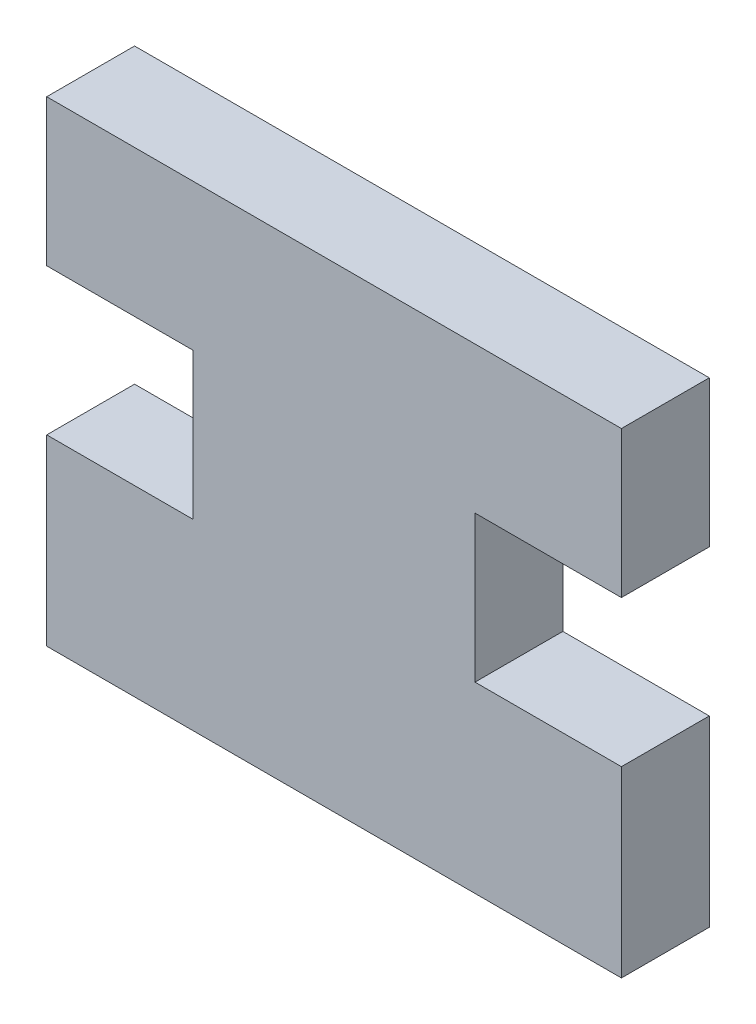
ISO-10303-21;
HEADER;
FILE_DESCRIPTION(('STEP AP214'),'2;1');
FILE_NAME('part.step','',(''),(''),'','','');
FILE_SCHEMA(('AUTOMOTIVE_DESIGN { 1 0 10303 214 1 1 1 1 }'));
ENDSEC;
DATA;
#1=APPLICATION_CONTEXT('core data for automotive mechanical design processes');
#2=APPLICATION_PROTOCOL_DEFINITION('international standard','automotive_design',2000,#1);
#3=PRODUCT_CONTEXT('',#1,'mechanical');
#4=PRODUCT('Part','Part','',(#3));
#5=PRODUCT_RELATED_PRODUCT_CATEGORY('part','',(#4));
#6=PRODUCT_DEFINITION_FORMATION('','',#4);
#7=PRODUCT_DEFINITION_CONTEXT('part definition',#1,'design');
#8=PRODUCT_DEFINITION('design','',#6,#7);
#9=PRODUCT_DEFINITION_SHAPE('','',#8);
#10=(LENGTH_UNIT() NAMED_UNIT(*) SI_UNIT(.MILLI.,.METRE.));
#11=(NAMED_UNIT(*) PLANE_ANGLE_UNIT() SI_UNIT($,.RADIAN.));
#12=(NAMED_UNIT(*) SI_UNIT($,.STERADIAN.) SOLID_ANGLE_UNIT());
#13=UNCERTAINTY_MEASURE_WITH_UNIT(LENGTH_MEASURE(1.E-05),#10,'distance_accuracy_value','');
#14=(GEOMETRIC_REPRESENTATION_CONTEXT(3) GLOBAL_UNCERTAINTY_ASSIGNED_CONTEXT((#13)) GLOBAL_UNIT_ASSIGNED_CONTEXT((#10,
#11,#12)) REPRESENTATION_CONTEXT('',''));
#15=CARTESIAN_POINT('',(0.,0.,0.));
#16=DIRECTION('',(0.,0.,1.));
#17=DIRECTION('',(1.,0.,0.));
#18=AXIS2_PLACEMENT_3D('',#15,#16,#17);
#19=CARTESIAN_POINT('',(1.57,0.,0.24));
#20=DIRECTION('',(0.,1.,0.));
#21=DIRECTION('',(-1.,0.,0.));
#22=AXIS2_PLACEMENT_3D('',#19,#20,#21);
#23=PLANE('',#22);
#24=DIRECTION('',(1.,0.,0.));
#25=VECTOR('',#24,1.);
#26=CARTESIAN_POINT('',(1.57,0.,0.));
#27=LINE('',#26,#25);
#28=CARTESIAN_POINT('',(0.,0.,0.));
#29=VERTEX_POINT('',#28);
#30=CARTESIAN_POINT('',(1.57,0.,0.));
#31=VERTEX_POINT('',#30);
#32=EDGE_CURVE('E188',#29,#31,#27,.T.);
#33=ORIENTED_EDGE('',*,*,#32,.T.);
#34=DIRECTION('',(0.,0.,-1.));
#35=VECTOR('',#34,1.);
#36=CARTESIAN_POINT('',(1.57,0.,0.24));
#37=LINE('',#36,#35);
#38=CARTESIAN_POINT('',(1.57,0.,0.24));
#39=VERTEX_POINT('',#38);
#40=EDGE_CURVE('E11',#39,#31,#37,.T.);
#41=ORIENTED_EDGE('',*,*,#40,.F.);
#42=DIRECTION('',(1.,0.,0.));
#43=VECTOR('',#42,1.);
#44=CARTESIAN_POINT('',(1.57,0.,0.24));
#45=LINE('',#44,#43);
#46=CARTESIAN_POINT('',(0.,0.,0.24));
#47=VERTEX_POINT('',#46);
#48=EDGE_CURVE('E221',#47,#39,#45,.T.);
#49=ORIENTED_EDGE('',*,*,#48,.F.);
#50=DIRECTION('',(0.,0.,-1.));
#51=VECTOR('',#50,1.);
#52=CARTESIAN_POINT('',(0.,0.,0.24));
#53=LINE('',#52,#51);
#54=EDGE_CURVE('E184',#47,#29,#53,.T.);
#55=ORIENTED_EDGE('',*,*,#54,.T.);
#56=EDGE_LOOP('',(#33,#41,#49,#55));
#57=FACE_BOUND('',#56,.T.);
#58=ADVANCED_FACE('F41',(#57),#23,.F.);
#59=CARTESIAN_POINT('',(1.57,0.5,0.24));
#60=DIRECTION('',(-1.,0.,0.));
#61=DIRECTION('',(0.,0.,1.));
#62=AXIS2_PLACEMENT_3D('',#59,#60,#61);
#63=PLANE('',#62);
#64=DIRECTION('',(0.,1.,0.));
#65=VECTOR('',#64,1.);
#66=CARTESIAN_POINT('',(1.57,0.5,0.));
#67=LINE('',#66,#65);
#68=CARTESIAN_POINT('',(1.57,0.5,0.));
#69=VERTEX_POINT('',#68);
#70=EDGE_CURVE('E192',#31,#69,#67,.T.);
#71=ORIENTED_EDGE('',*,*,#70,.T.);
#72=DIRECTION('',(0.,0.,-1.));
#73=VECTOR('',#72,1.);
#74=CARTESIAN_POINT('',(1.57,0.5,0.24));
#75=LINE('',#74,#73);
#76=CARTESIAN_POINT('',(1.57,0.5,0.24));
#77=VERTEX_POINT('',#76);
#78=EDGE_CURVE('E50',#77,#69,#75,.T.);
#79=ORIENTED_EDGE('',*,*,#78,.F.);
#80=DIRECTION('',(0.,1.,0.));
#81=VECTOR('',#80,1.);
#82=CARTESIAN_POINT('',(1.57,0.5,0.24));
#83=LINE('',#82,#81);
#84=EDGE_CURVE('E129',#39,#77,#83,.T.);
#85=ORIENTED_EDGE('',*,*,#84,.F.);
#86=ORIENTED_EDGE('',*,*,#40,.T.);
#87=EDGE_LOOP('',(#71,#79,#85,#86));
#88=FACE_BOUND('',#87,.T.);
#89=ADVANCED_FACE('F297',(#88),#63,.F.);
#90=CARTESIAN_POINT('',(1.17,0.5,0.24));
#91=DIRECTION('',(0.,-1.,0.));
#92=DIRECTION('',(0.,0.,-1.));
#93=AXIS2_PLACEMENT_3D('',#90,#91,#92);
#94=PLANE('',#93);
#95=DIRECTION('',(-1.,0.,0.));
#96=VECTOR('',#95,1.);
#97=CARTESIAN_POINT('',(1.17,0.5,0.));
#98=LINE('',#97,#96);
#99=CARTESIAN_POINT('',(1.17,0.5,0.));
#100=VERTEX_POINT('',#99);
#101=EDGE_CURVE('E195',#69,#100,#98,.T.);
#102=ORIENTED_EDGE('',*,*,#101,.T.);
#103=DIRECTION('',(0.,0.,-1.));
#104=VECTOR('',#103,1.);
#105=CARTESIAN_POINT('',(1.17,0.5,0.24));
#106=LINE('',#105,#104);
#107=CARTESIAN_POINT('',(1.17,0.5,0.24));
#108=VERTEX_POINT('',#107);
#109=EDGE_CURVE('E247',#108,#100,#106,.T.);
#110=ORIENTED_EDGE('',*,*,#109,.F.);
#111=DIRECTION('',(-1.,0.,0.));
#112=VECTOR('',#111,1.);
#113=CARTESIAN_POINT('',(1.17,0.5,0.24));
#114=LINE('',#113,#112);
#115=EDGE_CURVE('E259',#77,#108,#114,.T.);
#116=ORIENTED_EDGE('',*,*,#115,.F.);
#117=ORIENTED_EDGE('',*,*,#78,.T.);
#118=EDGE_LOOP('',(#102,#110,#116,#117));
#119=FACE_BOUND('',#118,.T.);
#120=ADVANCED_FACE('F257',(#119),#94,.F.);
#121=CARTESIAN_POINT('',(1.17,0.9,0.24));
#122=DIRECTION('',(-1.,0.,0.));
#123=DIRECTION('',(0.,0.,1.));
#124=AXIS2_PLACEMENT_3D('',#121,#122,#123);
#125=PLANE('',#124);
#126=DIRECTION('',(0.,1.,0.));
#127=VECTOR('',#126,1.);
#128=CARTESIAN_POINT('',(1.17,0.9,0.));
#129=LINE('',#128,#127);
#130=CARTESIAN_POINT('',(1.17,0.9,0.));
#131=VERTEX_POINT('',#130);
#132=EDGE_CURVE('E198',#100,#131,#129,.T.);
#133=ORIENTED_EDGE('',*,*,#132,.T.);
#134=DIRECTION('',(0.,0.,-1.));
#135=VECTOR('',#134,1.);
#136=CARTESIAN_POINT('',(1.17,0.9,0.24));
#137=LINE('',#136,#135);
#138=CARTESIAN_POINT('',(1.17,0.9,0.24));
#139=VERTEX_POINT('',#138);
#140=EDGE_CURVE('E243',#139,#131,#137,.T.);
#141=ORIENTED_EDGE('',*,*,#140,.F.);
#142=DIRECTION('',(0.,1.,0.));
#143=VECTOR('',#142,1.);
#144=CARTESIAN_POINT('',(1.17,0.9,0.24));
#145=LINE('',#144,#143);
#146=EDGE_CURVE('E278',#108,#139,#145,.T.);
#147=ORIENTED_EDGE('',*,*,#146,.F.);
#148=ORIENTED_EDGE('',*,*,#109,.T.);
#149=EDGE_LOOP('',(#133,#141,#147,#148));
#150=FACE_BOUND('',#149,.T.);
#151=ADVANCED_FACE('F268',(#150),#125,.F.);
#152=CARTESIAN_POINT('',(1.57,0.9,0.24));
#153=DIRECTION('',(0.,1.,0.));
#154=DIRECTION('',(0.,0.,1.));
#155=AXIS2_PLACEMENT_3D('',#152,#153,#154);
#156=PLANE('',#155);
#157=DIRECTION('',(1.,0.,0.));
#158=VECTOR('',#157,1.);
#159=CARTESIAN_POINT('',(1.57,0.9,0.));
#160=LINE('',#159,#158);
#161=CARTESIAN_POINT('',(1.57,0.9,0.));
#162=VERTEX_POINT('',#161);
#163=EDGE_CURVE('E201',#131,#162,#160,.T.);
#164=ORIENTED_EDGE('',*,*,#163,.T.);
#165=DIRECTION('',(0.,0.,-1.));
#166=VECTOR('',#165,1.);
#167=CARTESIAN_POINT('',(1.57,0.9,0.24));
#168=LINE('',#167,#166);
#169=CARTESIAN_POINT('',(1.57,0.9,0.24));
#170=VERTEX_POINT('',#169);
#171=EDGE_CURVE('E239',#170,#162,#168,.T.);
#172=ORIENTED_EDGE('',*,*,#171,.F.);
#173=DIRECTION('',(1.,0.,0.));
#174=VECTOR('',#173,1.);
#175=CARTESIAN_POINT('',(1.57,0.9,0.24));
#176=LINE('',#175,#174);
#177=EDGE_CURVE('E274',#139,#170,#176,.T.);
#178=ORIENTED_EDGE('',*,*,#177,.F.);
#179=ORIENTED_EDGE('',*,*,#140,.T.);
#180=EDGE_LOOP('',(#164,#172,#178,#179));
#181=FACE_BOUND('',#180,.T.);
#182=ADVANCED_FACE('F272',(#181),#156,.F.);
#183=CARTESIAN_POINT('',(1.57,1.3,0.24));
#184=DIRECTION('',(-1.,0.,0.));
#185=DIRECTION('',(0.,0.,1.));
#186=AXIS2_PLACEMENT_3D('',#183,#184,#185);
#187=PLANE('',#186);
#188=DIRECTION('',(0.,1.,0.));
#189=VECTOR('',#188,1.);
#190=CARTESIAN_POINT('',(1.57,1.3,0.));
#191=LINE('',#190,#189);
#192=CARTESIAN_POINT('',(1.57,1.3,0.));
#193=VERTEX_POINT('',#192);
#194=EDGE_CURVE('E204',#162,#193,#191,.T.);
#195=ORIENTED_EDGE('',*,*,#194,.T.);
#196=DIRECTION('',(0.,0.,-1.));
#197=VECTOR('',#196,1.);
#198=CARTESIAN_POINT('',(1.57,1.3,0.24));
#199=LINE('',#198,#197);
#200=CARTESIAN_POINT('',(1.57,1.3,0.24));
#201=VERTEX_POINT('',#200);
#202=EDGE_CURVE('E235',#201,#193,#199,.T.);
#203=ORIENTED_EDGE('',*,*,#202,.F.);
#204=DIRECTION('',(0.,1.,0.));
#205=VECTOR('',#204,1.);
#206=CARTESIAN_POINT('',(1.57,1.3,0.24));
#207=LINE('',#206,#205);
#208=EDGE_CURVE('E277',#170,#201,#207,.T.);
#209=ORIENTED_EDGE('',*,*,#208,.F.);
#210=ORIENTED_EDGE('',*,*,#171,.T.);
#211=EDGE_LOOP('',(#195,#203,#209,#210));
#212=FACE_BOUND('',#211,.T.);
#213=ADVANCED_FACE('F309',(#212),#187,.F.);
#214=CARTESIAN_POINT('',(0.,1.3,0.24));
#215=DIRECTION('',(0.,-1.,0.));
#216=DIRECTION('',(0.,0.,-1.));
#217=AXIS2_PLACEMENT_3D('',#214,#215,#216);
#218=PLANE('',#217);
#219=DIRECTION('',(-1.,0.,0.));
#220=VECTOR('',#219,1.);
#221=CARTESIAN_POINT('',(0.,1.3,0.));
#222=LINE('',#221,#220);
#223=CARTESIAN_POINT('',(0.,1.3,0.));
#224=VERTEX_POINT('',#223);
#225=EDGE_CURVE('E207',#193,#224,#222,.T.);
#226=ORIENTED_EDGE('',*,*,#225,.T.);
#227=DIRECTION('',(0.,0.,-1.));
#228=VECTOR('',#227,1.);
#229=CARTESIAN_POINT('',(0.,1.3,0.24));
#230=LINE('',#229,#228);
#231=CARTESIAN_POINT('',(0.,1.3,0.24));
#232=VERTEX_POINT('',#231);
#233=EDGE_CURVE('E231',#232,#224,#230,.T.);
#234=ORIENTED_EDGE('',*,*,#233,.F.);
#235=DIRECTION('',(-1.,0.,0.));
#236=VECTOR('',#235,1.);
#237=CARTESIAN_POINT('',(0.,1.3,0.24));
#238=LINE('',#237,#236);
#239=EDGE_CURVE('E281',#201,#232,#238,.T.);
#240=ORIENTED_EDGE('',*,*,#239,.F.);
#241=ORIENTED_EDGE('',*,*,#202,.T.);
#242=EDGE_LOOP('',(#226,#234,#240,#241));
#243=FACE_BOUND('',#242,.T.);
#244=ADVANCED_FACE('F312',(#243),#218,.F.);
#245=CARTESIAN_POINT('',(0.,0.9,0.24));
#246=DIRECTION('',(1.,0.,0.));
#247=DIRECTION('',(0.,0.,-1.));
#248=AXIS2_PLACEMENT_3D('',#245,#246,#247);
#249=PLANE('',#248);
#250=DIRECTION('',(0.,-1.,0.));
#251=VECTOR('',#250,1.);
#252=CARTESIAN_POINT('',(0.,0.9,0.));
#253=LINE('',#252,#251);
#254=CARTESIAN_POINT('',(0.,0.9,0.));
#255=VERTEX_POINT('',#254);
#256=EDGE_CURVE('E210',#224,#255,#253,.T.);
#257=ORIENTED_EDGE('',*,*,#256,.T.);
#258=DIRECTION('',(0.,0.,-1.));
#259=VECTOR('',#258,1.);
#260=CARTESIAN_POINT('',(0.,0.9,0.24));
#261=LINE('',#260,#259);
#262=CARTESIAN_POINT('',(0.,0.9,0.24));
#263=VERTEX_POINT('',#262);
#264=EDGE_CURVE('E227',#263,#255,#261,.T.);
#265=ORIENTED_EDGE('',*,*,#264,.F.);
#266=DIRECTION('',(0.,-1.,0.));
#267=VECTOR('',#266,1.);
#268=CARTESIAN_POINT('',(0.,0.9,0.24));
#269=LINE('',#268,#267);
#270=EDGE_CURVE('E288',#232,#263,#269,.T.);
#271=ORIENTED_EDGE('',*,*,#270,.F.);
#272=ORIENTED_EDGE('',*,*,#233,.T.);
#273=EDGE_LOOP('',(#257,#265,#271,#272));
#274=FACE_BOUND('',#273,.T.);
#275=ADVANCED_FACE('F316',(#274),#249,.F.);
#276=CARTESIAN_POINT('',(0.4,0.9,0.24));
#277=DIRECTION('',(0.,1.,0.));
#278=DIRECTION('',(-1.,0.,0.));
#279=AXIS2_PLACEMENT_3D('',#276,#277,#278);
#280=PLANE('',#279);
#281=DIRECTION('',(1.,0.,0.));
#282=VECTOR('',#281,1.);
#283=CARTESIAN_POINT('',(0.4,0.9,0.));
#284=LINE('',#283,#282);
#285=CARTESIAN_POINT('',(0.4,0.9,0.));
#286=VERTEX_POINT('',#285);
#287=EDGE_CURVE('E213',#255,#286,#284,.T.);
#288=ORIENTED_EDGE('',*,*,#287,.T.);
#289=DIRECTION('',(0.,0.,-1.));
#290=VECTOR('',#289,1.);
#291=CARTESIAN_POINT('',(0.4,0.9,0.24));
#292=LINE('',#291,#290);
#293=CARTESIAN_POINT('',(0.4,0.9,0.24));
#294=VERTEX_POINT('',#293);
#295=EDGE_CURVE('E177',#294,#286,#292,.T.);
#296=ORIENTED_EDGE('',*,*,#295,.F.);
#297=DIRECTION('',(1.,0.,0.));
#298=VECTOR('',#297,1.);
#299=CARTESIAN_POINT('',(0.4,0.9,0.24));
#300=LINE('',#299,#298);
#301=EDGE_CURVE('E166',#263,#294,#300,.T.);
#302=ORIENTED_EDGE('',*,*,#301,.F.);
#303=ORIENTED_EDGE('',*,*,#264,.T.);
#304=EDGE_LOOP('',(#288,#296,#302,#303));
#305=FACE_BOUND('',#304,.T.);
#306=ADVANCED_FACE('F320',(#305),#280,.F.);
#307=CARTESIAN_POINT('',(0.4,0.5,0.24));
#308=DIRECTION('',(1.,0.,0.));
#309=DIRECTION('',(0.,1.,0.));
#310=AXIS2_PLACEMENT_3D('',#307,#308,#309);
#311=PLANE('',#310);
#312=DIRECTION('',(0.,-1.,0.));
#313=VECTOR('',#312,1.);
#314=CARTESIAN_POINT('',(0.4,0.5,0.));
#315=LINE('',#314,#313);
#316=CARTESIAN_POINT('',(0.4,0.5,0.));
#317=VERTEX_POINT('',#316);
#318=EDGE_CURVE('E175',#286,#317,#315,.T.);
#319=ORIENTED_EDGE('',*,*,#318,.T.);
#320=DIRECTION('',(0.,0.,-1.));
#321=VECTOR('',#320,1.);
#322=CARTESIAN_POINT('',(0.4,0.5,0.24));
#323=LINE('',#322,#321);
#324=CARTESIAN_POINT('',(0.4,0.5,0.24));
#325=VERTEX_POINT('',#324);
#326=EDGE_CURVE('E172',#325,#317,#323,.T.);
#327=ORIENTED_EDGE('',*,*,#326,.F.);
#328=DIRECTION('',(0.,-1.,0.));
#329=VECTOR('',#328,1.);
#330=CARTESIAN_POINT('',(0.4,0.5,0.24));
#331=LINE('',#330,#329);
#332=EDGE_CURVE('E160',#294,#325,#331,.T.);
#333=ORIENTED_EDGE('',*,*,#332,.F.);
#334=ORIENTED_EDGE('',*,*,#295,.T.);
#335=EDGE_LOOP('',(#319,#327,#333,#334));
#336=FACE_BOUND('',#335,.T.);
#337=ADVANCED_FACE('F173',(#336),#311,.F.);
#338=CARTESIAN_POINT('',(0.,0.5,0.24));
#339=DIRECTION('',(0.,-1.,0.));
#340=DIRECTION('',(0.,0.,-1.));
#341=AXIS2_PLACEMENT_3D('',#338,#339,#340);
#342=PLANE('',#341);
#343=DIRECTION('',(-1.,0.,0.));
#344=VECTOR('',#343,1.);
#345=CARTESIAN_POINT('',(0.,0.5,0.));
#346=LINE('',#345,#344);
#347=CARTESIAN_POINT('',(0.,0.5,0.));
#348=VERTEX_POINT('',#347);
#349=EDGE_CURVE('E112',#317,#348,#346,.T.);
#350=ORIENTED_EDGE('',*,*,#349,.T.);
#351=DIRECTION('',(0.,0.,-1.));
#352=VECTOR('',#351,1.);
#353=CARTESIAN_POINT('',(0.,0.5,0.24));
#354=LINE('',#353,#352);
#355=CARTESIAN_POINT('',(0.,0.5,0.24));
#356=VERTEX_POINT('',#355);
#357=EDGE_CURVE('E178',#356,#348,#354,.T.);
#358=ORIENTED_EDGE('',*,*,#357,.F.);
#359=DIRECTION('',(-1.,0.,0.));
#360=VECTOR('',#359,1.);
#361=CARTESIAN_POINT('',(0.,0.5,0.24));
#362=LINE('',#361,#360);
#363=EDGE_CURVE('E164',#325,#356,#362,.T.);
#364=ORIENTED_EDGE('',*,*,#363,.F.);
#365=ORIENTED_EDGE('',*,*,#326,.T.);
#366=EDGE_LOOP('',(#350,#358,#364,#365));
#367=FACE_BOUND('',#366,.T.);
#368=ADVANCED_FACE('F180',(#367),#342,.F.);
#369=CARTESIAN_POINT('',(0.,0.,0.24));
#370=DIRECTION('',(1.,0.,0.));
#371=DIRECTION('',(0.,0.,-1.));
#372=AXIS2_PLACEMENT_3D('',#369,#370,#371);
#373=PLANE('',#372);
#374=DIRECTION('',(0.,-1.,0.));
#375=VECTOR('',#374,1.);
#376=CARTESIAN_POINT('',(0.,0.,0.));
#377=LINE('',#376,#375);
#378=EDGE_CURVE('E118',#348,#29,#377,.T.);
#379=ORIENTED_EDGE('',*,*,#378,.T.);
#380=ORIENTED_EDGE('',*,*,#54,.F.);
#381=DIRECTION('',(0.,-1.,0.));
#382=VECTOR('',#381,1.);
#383=CARTESIAN_POINT('',(0.,0.,0.24));
#384=LINE('',#383,#382);
#385=EDGE_CURVE('E58',#356,#47,#384,.T.);
#386=ORIENTED_EDGE('',*,*,#385,.F.);
#387=ORIENTED_EDGE('',*,*,#357,.T.);
#388=EDGE_LOOP('',(#379,#380,#386,#387));
#389=FACE_BOUND('',#388,.T.);
#390=ADVANCED_FACE('F329',(#389),#373,.F.);
#391=CARTESIAN_POINT('',(0.,0.,0.24));
#392=DIRECTION('',(0.,0.,-1.));
#393=DIRECTION('',(-1.,0.,0.));
#394=AXIS2_PLACEMENT_3D('',#391,#392,#393);
#395=PLANE('',#394);
#396=ORIENTED_EDGE('',*,*,#48,.T.);
#397=ORIENTED_EDGE('',*,*,#84,.T.);
#398=ORIENTED_EDGE('',*,*,#115,.T.);
#399=ORIENTED_EDGE('',*,*,#146,.T.);
#400=ORIENTED_EDGE('',*,*,#177,.T.);
#401=ORIENTED_EDGE('',*,*,#208,.T.);
#402=ORIENTED_EDGE('',*,*,#239,.T.);
#403=ORIENTED_EDGE('',*,*,#270,.T.);
#404=ORIENTED_EDGE('',*,*,#301,.T.);
#405=ORIENTED_EDGE('',*,*,#332,.T.);
#406=ORIENTED_EDGE('',*,*,#363,.T.);
#407=ORIENTED_EDGE('',*,*,#385,.T.);
#408=EDGE_LOOP('',(#396,#397,#398,#399,#400,#401,#402,#403,#404,#405,#406,#407));
#409=FACE_BOUND('',#408,.T.);
#410=ADVANCED_FACE('F162',(#409),#395,.F.);
#411=CARTESIAN_POINT('',(0.,0.,0.));
#412=DIRECTION('',(0.,0.,-1.));
#413=DIRECTION('',(-1.,0.,0.));
#414=AXIS2_PLACEMENT_3D('',#411,#412,#413);
#415=PLANE('',#414);
#416=ORIENTED_EDGE('',*,*,#32,.F.);
#417=ORIENTED_EDGE('',*,*,#378,.F.);
#418=ORIENTED_EDGE('',*,*,#349,.F.);
#419=ORIENTED_EDGE('',*,*,#318,.F.);
#420=ORIENTED_EDGE('',*,*,#287,.F.);
#421=ORIENTED_EDGE('',*,*,#256,.F.);
#422=ORIENTED_EDGE('',*,*,#225,.F.);
#423=ORIENTED_EDGE('',*,*,#194,.F.);
#424=ORIENTED_EDGE('',*,*,#163,.F.);
#425=ORIENTED_EDGE('',*,*,#132,.F.);
#426=ORIENTED_EDGE('',*,*,#101,.F.);
#427=ORIENTED_EDGE('',*,*,#70,.F.);
#428=EDGE_LOOP('',(#416,#417,#418,#419,#420,#421,#422,#423,#424,#425,#426,#427));
#429=FACE_BOUND('',#428,.T.);
#430=ADVANCED_FACE('F263',(#429),#415,.T.);
#431=CLOSED_SHELL('',(#58,#89,#120,#151,#182,#213,#244,#275,#306,#337,#368,#390,#410,#430));
#432=MANIFOLD_SOLID_BREP('B2',#431);
#433=ADVANCED_BREP_SHAPE_REPRESENTATION('',(#18,#432),#14);
#434=SHAPE_DEFINITION_REPRESENTATION(#9,#433);
ENDSEC;
END-ISO-10303-21;
